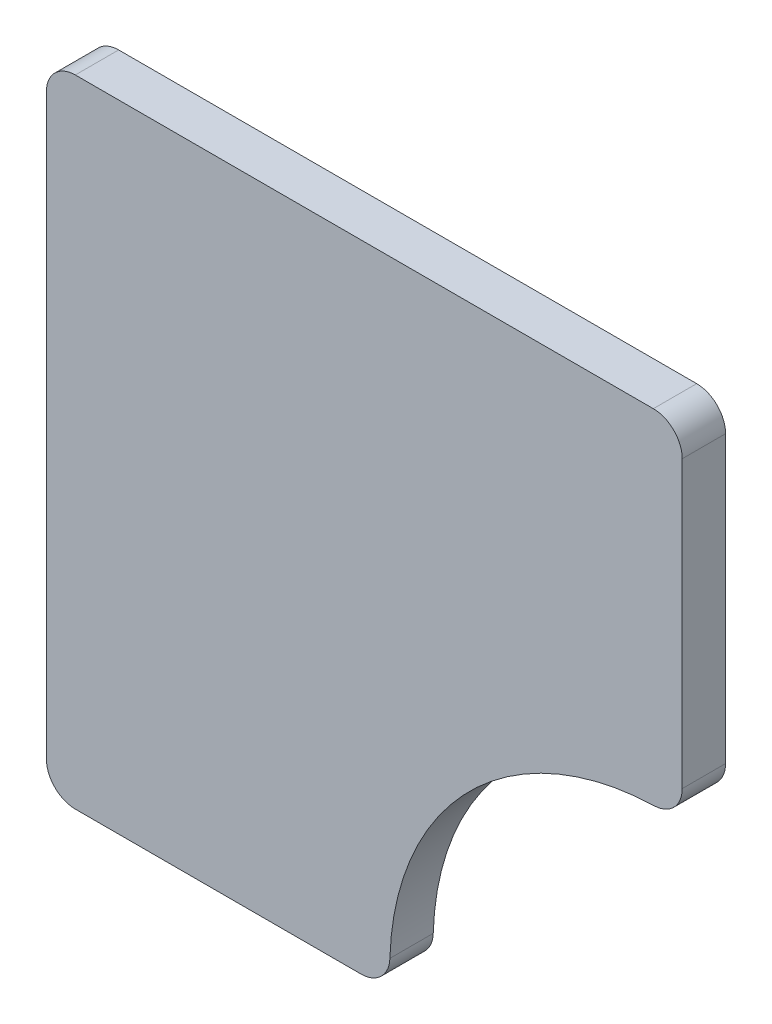
ISO-10303-21;
HEADER;
FILE_DESCRIPTION(('STEP AP214'),'2;1');
FILE_NAME('part.step','',(''),(''),'','','');
FILE_SCHEMA(('AUTOMOTIVE_DESIGN { 1 0 10303 214 1 1 1 1 }'));
ENDSEC;
DATA;
#1=APPLICATION_CONTEXT('core data for automotive mechanical design processes');
#2=APPLICATION_PROTOCOL_DEFINITION('international standard','automotive_design',2000,#1);
#3=PRODUCT_CONTEXT('',#1,'mechanical');
#4=PRODUCT('Part','Part','',(#3));
#5=PRODUCT_RELATED_PRODUCT_CATEGORY('part','',(#4));
#6=PRODUCT_DEFINITION_FORMATION('','',#4);
#7=PRODUCT_DEFINITION_CONTEXT('part definition',#1,'design');
#8=PRODUCT_DEFINITION('design','',#6,#7);
#9=PRODUCT_DEFINITION_SHAPE('','',#8);
#10=(LENGTH_UNIT() NAMED_UNIT(*) SI_UNIT(.MILLI.,.METRE.));
#11=(NAMED_UNIT(*) PLANE_ANGLE_UNIT() SI_UNIT($,.RADIAN.));
#12=(NAMED_UNIT(*) SI_UNIT($,.STERADIAN.) SOLID_ANGLE_UNIT());
#13=UNCERTAINTY_MEASURE_WITH_UNIT(LENGTH_MEASURE(1.E-05),#10,'distance_accuracy_value','');
#14=(GEOMETRIC_REPRESENTATION_CONTEXT(3) GLOBAL_UNCERTAINTY_ASSIGNED_CONTEXT((#13)) GLOBAL_UNIT_ASSIGNED_CONTEXT((#10,
#11,#12)) REPRESENTATION_CONTEXT('',''));
#15=CARTESIAN_POINT('',(0.,0.,0.));
#16=DIRECTION('',(0.,0.,1.));
#17=DIRECTION('',(1.,0.,0.));
#18=AXIS2_PLACEMENT_3D('',#15,#16,#17);
#19=CARTESIAN_POINT('',(-307.18455563937,591.94465213345,3.));
#20=DIRECTION('',(0.,0.,-1.));
#21=DIRECTION('',(-1.,0.,0.));
#22=AXIS2_PLACEMENT_3D('',#19,#20,#21);
#23=CYLINDRICAL_SURFACE('',#22,1.99999999999998);
#24=CARTESIAN_POINT('',(-307.18455563937,591.94465213345,0.));
#25=DIRECTION('',(0.,0.,1.));
#26=DIRECTION('',(1.,0.,0.));
#27=AXIS2_PLACEMENT_3D('',#24,#25,#26);
#28=CIRCLE('',#27,1.99999999999998);
#29=CARTESIAN_POINT('',(-307.1245916247,589.945551256319,0.));
#30=VERTEX_POINT('',#29);
#31=CARTESIAN_POINT('',(-305.18455563937,591.94465213345,0.));
#32=VERTEX_POINT('',#31);
#33=EDGE_CURVE('E154',#30,#32,#28,.T.);
#34=ORIENTED_EDGE('',*,*,#33,.T.);
#35=DIRECTION('',(0.,0.,-1.));
#36=VECTOR('',#35,1.);
#37=CARTESIAN_POINT('',(-305.18455563937,591.94465213345,3.));
#38=LINE('',#37,#36);
#39=CARTESIAN_POINT('',(-305.18455563937,591.94465213345,3.));
#40=VERTEX_POINT('',#39);
#41=EDGE_CURVE('E11',#40,#32,#38,.T.);
#42=ORIENTED_EDGE('',*,*,#41,.F.);
#43=CARTESIAN_POINT('',(-307.18455563937,591.94465213345,3.));
#44=DIRECTION('',(0.,0.,1.));
#45=DIRECTION('',(1.,0.,0.));
#46=AXIS2_PLACEMENT_3D('',#43,#44,#45);
#47=CIRCLE('',#46,1.99999999999998);
#48=CARTESIAN_POINT('',(-307.1245916247,589.945551256319,3.));
#49=VERTEX_POINT('',#48);
#50=EDGE_CURVE('E182',#49,#40,#47,.T.);
#51=ORIENTED_EDGE('',*,*,#50,.F.);
#52=DIRECTION('',(0.,0.,-1.));
#53=VECTOR('',#52,1.);
#54=CARTESIAN_POINT('',(-307.1245916247,589.945551256319,3.));
#55=LINE('',#54,#53);
#56=EDGE_CURVE('E150',#49,#30,#55,.T.);
#57=ORIENTED_EDGE('',*,*,#56,.T.);
#58=EDGE_LOOP('',(#34,#42,#51,#57));
#59=FACE_BOUND('',#58,.T.);
#60=ADVANCED_FACE('F41',(#59),#23,.T.);
#61=CARTESIAN_POINT('',(-305.18455563937,591.94465213345,3.));
#62=DIRECTION('',(-1.,0.,0.));
#63=DIRECTION('',(0.,0.,1.));
#64=AXIS2_PLACEMENT_3D('',#61,#62,#63);
#65=PLANE('',#64);
#66=DIRECTION('',(0.,1.,0.));
#67=VECTOR('',#66,1.);
#68=CARTESIAN_POINT('',(-305.18455563937,591.94465213345,0.));
#69=LINE('',#68,#67);
#70=CARTESIAN_POINT('',(-305.18455563937,611.714480844847,0.));
#71=VERTEX_POINT('',#70);
#72=EDGE_CURVE('E158',#32,#71,#69,.T.);
#73=ORIENTED_EDGE('',*,*,#72,.T.);
#74=DIRECTION('',(0.,0.,-1.));
#75=VECTOR('',#74,1.);
#76=CARTESIAN_POINT('',(-305.18455563937,611.714480844847,3.));
#77=LINE('',#76,#75);
#78=CARTESIAN_POINT('',(-305.18455563937,611.714480844847,3.));
#79=VERTEX_POINT('',#78);
#80=EDGE_CURVE('E50',#79,#71,#77,.T.);
#81=ORIENTED_EDGE('',*,*,#80,.F.);
#82=DIRECTION('',(0.,1.,0.));
#83=VECTOR('',#82,1.);
#84=CARTESIAN_POINT('',(-305.18455563937,591.94465213345,3.));
#85=LINE('',#84,#83);
#86=EDGE_CURVE('E107',#40,#79,#85,.T.);
#87=ORIENTED_EDGE('',*,*,#86,.F.);
#88=ORIENTED_EDGE('',*,*,#41,.T.);
#89=EDGE_LOOP('',(#73,#81,#87,#88));
#90=FACE_BOUND('',#89,.T.);
#91=ADVANCED_FACE('F246',(#90),#65,.F.);
#92=CARTESIAN_POINT('',(-307.18455563937,611.714480844847,3.));
#93=DIRECTION('',(0.,0.,-1.));
#94=DIRECTION('',(-1.,0.,0.));
#95=AXIS2_PLACEMENT_3D('',#92,#93,#94);
#96=CYLINDRICAL_SURFACE('',#95,2.);
#97=CARTESIAN_POINT('',(-307.18455563937,611.714480844847,0.));
#98=DIRECTION('',(0.,0.,1.));
#99=DIRECTION('',(-1.,0.,0.));
#100=AXIS2_PLACEMENT_3D('',#97,#98,#99);
#101=CIRCLE('',#100,2.);
#102=CARTESIAN_POINT('',(-307.18455563937,613.714480844847,0.));
#103=VERTEX_POINT('',#102);
#104=EDGE_CURVE('E161',#71,#103,#101,.T.);
#105=ORIENTED_EDGE('',*,*,#104,.T.);
#106=DIRECTION('',(0.,0.,-1.));
#107=VECTOR('',#106,1.);
#108=CARTESIAN_POINT('',(-307.18455563937,613.714480844847,3.));
#109=LINE('',#108,#107);
#110=CARTESIAN_POINT('',(-307.18455563937,613.714480844847,3.));
#111=VERTEX_POINT('',#110);
#112=EDGE_CURVE('E201',#111,#103,#109,.T.);
#113=ORIENTED_EDGE('',*,*,#112,.F.);
#114=CARTESIAN_POINT('',(-307.18455563937,611.714480844847,3.));
#115=DIRECTION('',(0.,0.,1.));
#116=DIRECTION('',(-1.,0.,0.));
#117=AXIS2_PLACEMENT_3D('',#114,#115,#116);
#118=CIRCLE('',#117,2.);
#119=EDGE_CURVE('E211',#79,#111,#118,.T.);
#120=ORIENTED_EDGE('',*,*,#119,.F.);
#121=ORIENTED_EDGE('',*,*,#80,.T.);
#122=EDGE_LOOP('',(#105,#113,#120,#121));
#123=FACE_BOUND('',#122,.T.);
#124=ADVANCED_FACE('F209',(#123),#96,.T.);
#125=CARTESIAN_POINT('',(-307.18455563937,613.714480844847,3.));
#126=DIRECTION('',(0.,-1.,0.));
#127=DIRECTION('',(0.,0.,-1.));
#128=AXIS2_PLACEMENT_3D('',#125,#126,#127);
#129=PLANE('',#128);
#130=DIRECTION('',(-1.,0.,0.));
#131=VECTOR('',#130,1.);
#132=CARTESIAN_POINT('',(-307.18455563937,613.714480844847,0.));
#133=LINE('',#132,#131);
#134=CARTESIAN_POINT('',(-347.18455563937,613.714480844847,0.));
#135=VERTEX_POINT('',#134);
#136=EDGE_CURVE('E164',#103,#135,#133,.T.);
#137=ORIENTED_EDGE('',*,*,#136,.T.);
#138=DIRECTION('',(0.,0.,-1.));
#139=VECTOR('',#138,1.);
#140=CARTESIAN_POINT('',(-347.18455563937,613.714480844847,3.));
#141=LINE('',#140,#139);
#142=CARTESIAN_POINT('',(-347.18455563937,613.714480844847,3.));
#143=VERTEX_POINT('',#142);
#144=EDGE_CURVE('E197',#143,#135,#141,.T.);
#145=ORIENTED_EDGE('',*,*,#144,.F.);
#146=DIRECTION('',(-1.,0.,0.));
#147=VECTOR('',#146,1.);
#148=CARTESIAN_POINT('',(-307.18455563937,613.714480844847,3.));
#149=LINE('',#148,#147);
#150=EDGE_CURVE('E230',#111,#143,#149,.T.);
#151=ORIENTED_EDGE('',*,*,#150,.F.);
#152=ORIENTED_EDGE('',*,*,#112,.T.);
#153=EDGE_LOOP('',(#137,#145,#151,#152));
#154=FACE_BOUND('',#153,.T.);
#155=ADVANCED_FACE('F220',(#154),#129,.F.);
#156=CARTESIAN_POINT('',(-347.18455563937,611.714480844847,3.));
#157=DIRECTION('',(0.,0.,-1.));
#158=DIRECTION('',(-1.,0.,0.));
#159=AXIS2_PLACEMENT_3D('',#156,#157,#158);
#160=CYLINDRICAL_SURFACE('',#159,2.);
#161=CARTESIAN_POINT('',(-347.18455563937,611.714480844847,0.));
#162=DIRECTION('',(0.,0.,1.));
#163=DIRECTION('',(-1.,0.,0.));
#164=AXIS2_PLACEMENT_3D('',#161,#162,#163);
#165=CIRCLE('',#164,2.);
#166=CARTESIAN_POINT('',(-349.18455563937,611.714480844847,0.));
#167=VERTEX_POINT('',#166);
#168=EDGE_CURVE('E167',#135,#167,#165,.T.);
#169=ORIENTED_EDGE('',*,*,#168,.T.);
#170=DIRECTION('',(0.,0.,-1.));
#171=VECTOR('',#170,1.);
#172=CARTESIAN_POINT('',(-349.18455563937,611.714480844847,3.));
#173=LINE('',#172,#171);
#174=CARTESIAN_POINT('',(-349.18455563937,611.714480844847,3.));
#175=VERTEX_POINT('',#174);
#176=EDGE_CURVE('E193',#175,#167,#173,.T.);
#177=ORIENTED_EDGE('',*,*,#176,.F.);
#178=CARTESIAN_POINT('',(-347.18455563937,611.714480844847,3.));
#179=DIRECTION('',(0.,0.,1.));
#180=DIRECTION('',(-1.,0.,0.));
#181=AXIS2_PLACEMENT_3D('',#178,#179,#180);
#182=CIRCLE('',#181,2.);
#183=EDGE_CURVE('E226',#143,#175,#182,.T.);
#184=ORIENTED_EDGE('',*,*,#183,.F.);
#185=ORIENTED_EDGE('',*,*,#144,.T.);
#186=EDGE_LOOP('',(#169,#177,#184,#185));
#187=FACE_BOUND('',#186,.T.);
#188=ADVANCED_FACE('F224',(#187),#160,.T.);
#189=CARTESIAN_POINT('',(-349.18455563937,611.714480844847,3.));
#190=DIRECTION('',(1.,0.,0.));
#191=DIRECTION('',(0.,0.,-1.));
#192=AXIS2_PLACEMENT_3D('',#189,#190,#191);
#193=PLANE('',#192);
#194=DIRECTION('',(0.,-1.,0.));
#195=VECTOR('',#194,1.);
#196=CARTESIAN_POINT('',(-349.18455563937,611.714480844847,0.));
#197=LINE('',#196,#195);
#198=CARTESIAN_POINT('',(-349.18455563937,571.714480844847,0.));
#199=VERTEX_POINT('',#198);
#200=EDGE_CURVE('E170',#167,#199,#197,.T.);
#201=ORIENTED_EDGE('',*,*,#200,.T.);
#202=DIRECTION('',(0.,0.,-1.));
#203=VECTOR('',#202,1.);
#204=CARTESIAN_POINT('',(-349.18455563937,571.714480844847,3.));
#205=LINE('',#204,#203);
#206=CARTESIAN_POINT('',(-349.18455563937,571.714480844847,3.));
#207=VERTEX_POINT('',#206);
#208=EDGE_CURVE('E189',#207,#199,#205,.T.);
#209=ORIENTED_EDGE('',*,*,#208,.F.);
#210=DIRECTION('',(0.,-1.,0.));
#211=VECTOR('',#210,1.);
#212=CARTESIAN_POINT('',(-349.18455563937,611.714480844847,3.));
#213=LINE('',#212,#211);
#214=EDGE_CURVE('E229',#175,#207,#213,.T.);
#215=ORIENTED_EDGE('',*,*,#214,.F.);
#216=ORIENTED_EDGE('',*,*,#176,.T.);
#217=EDGE_LOOP('',(#201,#209,#215,#216));
#218=FACE_BOUND('',#217,.T.);
#219=ADVANCED_FACE('F258',(#218),#193,.F.);
#220=CARTESIAN_POINT('',(-347.18455563937,571.714480844847,3.));
#221=DIRECTION('',(0.,0.,-1.));
#222=DIRECTION('',(-1.,0.,0.));
#223=AXIS2_PLACEMENT_3D('',#220,#221,#222);
#224=CYLINDRICAL_SURFACE('',#223,2.);
#225=CARTESIAN_POINT('',(-347.18455563937,571.714480844847,0.));
#226=DIRECTION('',(0.,0.,1.));
#227=DIRECTION('',(-1.,0.,0.));
#228=AXIS2_PLACEMENT_3D('',#225,#226,#227);
#229=CIRCLE('',#228,2.);
#230=CARTESIAN_POINT('',(-347.18455563937,569.714480844847,0.));
#231=VERTEX_POINT('',#230);
#232=EDGE_CURVE('E173',#199,#231,#229,.T.);
#233=ORIENTED_EDGE('',*,*,#232,.T.);
#234=DIRECTION('',(0.,0.,-1.));
#235=VECTOR('',#234,1.);
#236=CARTESIAN_POINT('',(-347.18455563937,569.714480844847,3.));
#237=LINE('',#236,#235);
#238=CARTESIAN_POINT('',(-347.18455563937,569.714480844847,3.));
#239=VERTEX_POINT('',#238);
#240=EDGE_CURVE('E143',#239,#231,#237,.T.);
#241=ORIENTED_EDGE('',*,*,#240,.F.);
#242=CARTESIAN_POINT('',(-347.18455563937,571.714480844847,3.));
#243=DIRECTION('',(0.,0.,1.));
#244=DIRECTION('',(-1.,0.,0.));
#245=AXIS2_PLACEMENT_3D('',#242,#243,#244);
#246=CIRCLE('',#245,2.);
#247=EDGE_CURVE('E132',#207,#239,#246,.T.);
#248=ORIENTED_EDGE('',*,*,#247,.F.);
#249=ORIENTED_EDGE('',*,*,#208,.T.);
#250=EDGE_LOOP('',(#233,#241,#248,#249));
#251=FACE_BOUND('',#250,.T.);
#252=ADVANCED_FACE('F261',(#251),#224,.T.);
#253=CARTESIAN_POINT('',(-347.18455563937,569.714480844847,3.));
#254=DIRECTION('',(0.,1.,0.));
#255=DIRECTION('',(0.,0.,1.));
#256=AXIS2_PLACEMENT_3D('',#253,#254,#255);
#257=PLANE('',#256);
#258=DIRECTION('',(1.,0.,0.));
#259=VECTOR('',#258,1.);
#260=CARTESIAN_POINT('',(-347.18455563937,569.714480844847,0.));
#261=LINE('',#260,#259);
#262=CARTESIAN_POINT('',(-327.414726927973,569.714480844847,0.));
#263=VERTEX_POINT('',#262);
#264=EDGE_CURVE('E141',#231,#263,#261,.T.);
#265=ORIENTED_EDGE('',*,*,#264,.T.);
#266=DIRECTION('',(0.,0.,-1.));
#267=VECTOR('',#266,1.);
#268=CARTESIAN_POINT('',(-327.414726927973,569.714480844847,3.));
#269=LINE('',#268,#267);
#270=CARTESIAN_POINT('',(-327.414726927973,569.714480844847,3.));
#271=VERTEX_POINT('',#270);
#272=EDGE_CURVE('E138',#271,#263,#269,.T.);
#273=ORIENTED_EDGE('',*,*,#272,.F.);
#274=DIRECTION('',(1.,0.,0.));
#275=VECTOR('',#274,1.);
#276=CARTESIAN_POINT('',(-347.18455563937,569.714480844847,3.));
#277=LINE('',#276,#275);
#278=EDGE_CURVE('E126',#239,#271,#277,.T.);
#279=ORIENTED_EDGE('',*,*,#278,.F.);
#280=ORIENTED_EDGE('',*,*,#240,.T.);
#281=EDGE_LOOP('',(#265,#273,#279,#280));
#282=FACE_BOUND('',#281,.T.);
#283=ADVANCED_FACE('F139',(#282),#257,.F.);
#284=CARTESIAN_POINT('',(-327.414726927973,571.714480844847,3.));
#285=DIRECTION('',(0.,0.,-1.));
#286=DIRECTION('',(-1.,0.,0.));
#287=AXIS2_PLACEMENT_3D('',#284,#285,#286);
#288=CYLINDRICAL_SURFACE('',#287,2.00000000000001);
#289=CARTESIAN_POINT('',(-327.414726927973,571.714480844847,0.));
#290=DIRECTION('',(0.,0.,1.));
#291=DIRECTION('',(1.,0.,0.));
#292=AXIS2_PLACEMENT_3D('',#289,#290,#291);
#293=CIRCLE('',#292,2.00000000000001);
#294=CARTESIAN_POINT('',(-325.415626050842,571.654516830176,0.));
#295=VERTEX_POINT('',#294);
#296=EDGE_CURVE('E93',#263,#295,#293,.T.);
#297=ORIENTED_EDGE('',*,*,#296,.T.);
#298=DIRECTION('',(0.,0.,-1.));
#299=VECTOR('',#298,1.);
#300=CARTESIAN_POINT('',(-325.415626050842,571.654516830176,3.));
#301=LINE('',#300,#299);
#302=CARTESIAN_POINT('',(-325.415626050842,571.654516830176,3.));
#303=VERTEX_POINT('',#302);
#304=EDGE_CURVE('E144',#303,#295,#301,.T.);
#305=ORIENTED_EDGE('',*,*,#304,.F.);
#306=CARTESIAN_POINT('',(-327.414726927973,571.714480844847,3.));
#307=DIRECTION('',(0.,0.,1.));
#308=DIRECTION('',(1.,0.,0.));
#309=AXIS2_PLACEMENT_3D('',#306,#307,#308);
#310=CIRCLE('',#309,2.00000000000001);
#311=EDGE_CURVE('E130',#271,#303,#310,.T.);
#312=ORIENTED_EDGE('',*,*,#311,.F.);
#313=ORIENTED_EDGE('',*,*,#272,.T.);
#314=EDGE_LOOP('',(#297,#305,#312,#313));
#315=FACE_BOUND('',#314,.T.);
#316=ADVANCED_FACE('F146',(#315),#288,.T.);
#317=CARTESIAN_POINT('',(-306.558977160915,571.088902366391,3.));
#318=DIRECTION('',(0.,0.,-1.));
#319=DIRECTION('',(-1.,0.,0.));
#320=AXIS2_PLACEMENT_3D('',#317,#318,#319);
#321=CYLINDRICAL_SURFACE('',#320,18.865129924802);
#322=CARTESIAN_POINT('',(-306.558977160915,571.088902366391,0.));
#323=DIRECTION('',(0.,0.,-1.));
#324=DIRECTION('',(1.,0.,0.));
#325=AXIS2_PLACEMENT_3D('',#322,#323,#324);
#326=CIRCLE('',#325,18.865129924802);
#327=EDGE_CURVE('E99',#295,#30,#326,.T.);
#328=ORIENTED_EDGE('',*,*,#327,.T.);
#329=ORIENTED_EDGE('',*,*,#56,.F.);
#330=CARTESIAN_POINT('',(-306.558977160915,571.088902366391,3.));
#331=DIRECTION('',(0.,0.,-1.));
#332=DIRECTION('',(1.,0.,0.));
#333=AXIS2_PLACEMENT_3D('',#330,#331,#332);
#334=CIRCLE('',#333,18.865129924802);
#335=EDGE_CURVE('E58',#303,#49,#334,.T.);
#336=ORIENTED_EDGE('',*,*,#335,.F.);
#337=ORIENTED_EDGE('',*,*,#304,.T.);
#338=EDGE_LOOP('',(#328,#329,#336,#337));
#339=FACE_BOUND('',#338,.T.);
#340=ADVANCED_FACE('F270',(#339),#321,.F.);
#341=CARTESIAN_POINT('',(-307.18455563937,591.94465213345,3.));
#342=DIRECTION('',(0.,0.,1.));
#343=DIRECTION('',(1.,0.,0.));
#344=AXIS2_PLACEMENT_3D('',#341,#342,#343);
#345=PLANE('',#344);
#346=ORIENTED_EDGE('',*,*,#50,.T.);
#347=ORIENTED_EDGE('',*,*,#86,.T.);
#348=ORIENTED_EDGE('',*,*,#119,.T.);
#349=ORIENTED_EDGE('',*,*,#150,.T.);
#350=ORIENTED_EDGE('',*,*,#183,.T.);
#351=ORIENTED_EDGE('',*,*,#214,.T.);
#352=ORIENTED_EDGE('',*,*,#247,.T.);
#353=ORIENTED_EDGE('',*,*,#278,.T.);
#354=ORIENTED_EDGE('',*,*,#311,.T.);
#355=ORIENTED_EDGE('',*,*,#335,.T.);
#356=EDGE_LOOP('',(#346,#347,#348,#349,#350,#351,#352,#353,#354,#355));
#357=FACE_BOUND('',#356,.T.);
#358=ADVANCED_FACE('F128',(#357),#345,.T.);
#359=CARTESIAN_POINT('',(-307.18455563937,591.94465213345,0.));
#360=DIRECTION('',(0.,0.,1.));
#361=DIRECTION('',(1.,0.,0.));
#362=AXIS2_PLACEMENT_3D('',#359,#360,#361);
#363=PLANE('',#362);
#364=ORIENTED_EDGE('',*,*,#33,.F.);
#365=ORIENTED_EDGE('',*,*,#327,.F.);
#366=ORIENTED_EDGE('',*,*,#296,.F.);
#367=ORIENTED_EDGE('',*,*,#264,.F.);
#368=ORIENTED_EDGE('',*,*,#232,.F.);
#369=ORIENTED_EDGE('',*,*,#200,.F.);
#370=ORIENTED_EDGE('',*,*,#168,.F.);
#371=ORIENTED_EDGE('',*,*,#136,.F.);
#372=ORIENTED_EDGE('',*,*,#104,.F.);
#373=ORIENTED_EDGE('',*,*,#72,.F.);
#374=EDGE_LOOP('',(#364,#365,#366,#367,#368,#369,#370,#371,#372,#373));
#375=FACE_BOUND('',#374,.T.);
#376=ADVANCED_FACE('F215',(#375),#363,.F.);
#377=CLOSED_SHELL('',(#60,#91,#124,#155,#188,#219,#252,#283,#316,#340,#358,#376));
#378=MANIFOLD_SOLID_BREP('B2',#377);
#379=ADVANCED_BREP_SHAPE_REPRESENTATION('',(#18,#378),#14);
#380=SHAPE_DEFINITION_REPRESENTATION(#9,#379);
ENDSEC;
END-ISO-10303-21;
